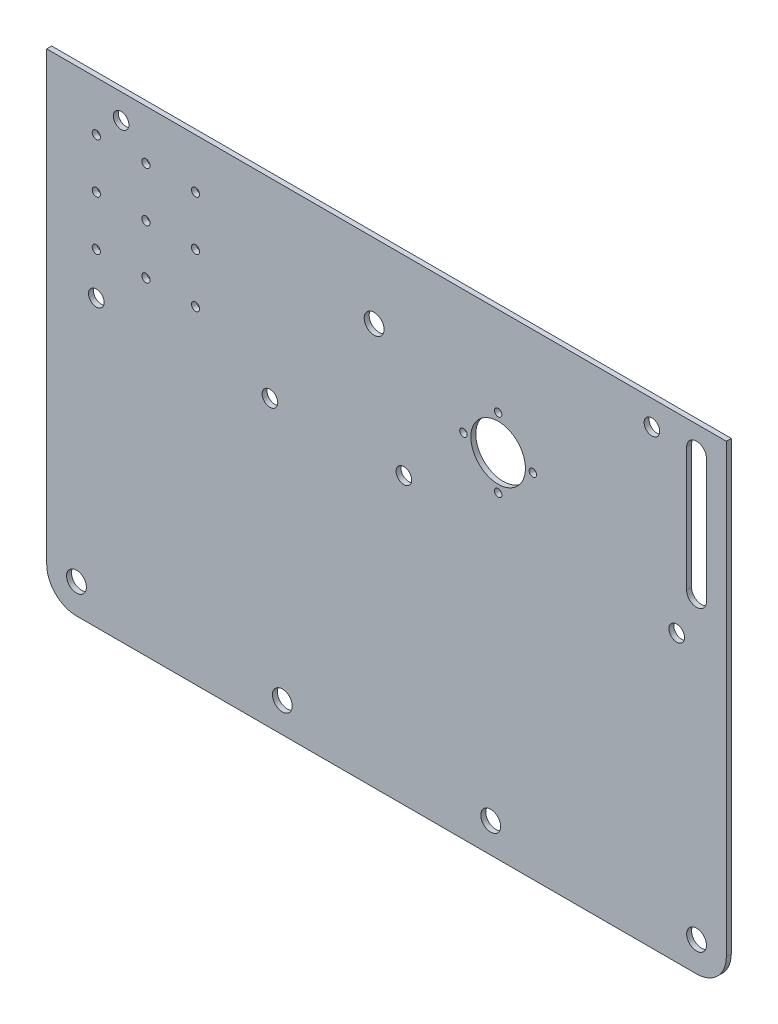
ISO-10303-21;
HEADER;
FILE_DESCRIPTION(('STEP AP214'),'2;1');
FILE_NAME('part.step','',(''),(''),'','','');
FILE_SCHEMA(('AUTOMOTIVE_DESIGN { 1 0 10303 214 1 1 1 1 }'));
ENDSEC;
DATA;
#1=APPLICATION_CONTEXT('core data for automotive mechanical design processes');
#2=APPLICATION_PROTOCOL_DEFINITION('international standard','automotive_design',2000,#1);
#3=PRODUCT_CONTEXT('',#1,'mechanical');
#4=PRODUCT('Part','Part','',(#3));
#5=PRODUCT_RELATED_PRODUCT_CATEGORY('part','',(#4));
#6=PRODUCT_DEFINITION_FORMATION('','',#4);
#7=PRODUCT_DEFINITION_CONTEXT('part definition',#1,'design');
#8=PRODUCT_DEFINITION('design','',#6,#7);
#9=PRODUCT_DEFINITION_SHAPE('','',#8);
#10=(LENGTH_UNIT() NAMED_UNIT(*) SI_UNIT(.MILLI.,.METRE.));
#11=(NAMED_UNIT(*) PLANE_ANGLE_UNIT() SI_UNIT($,.RADIAN.));
#12=(NAMED_UNIT(*) SI_UNIT($,.STERADIAN.) SOLID_ANGLE_UNIT());
#13=UNCERTAINTY_MEASURE_WITH_UNIT(LENGTH_MEASURE(1.E-05),#10,'distance_accuracy_value','');
#14=(GEOMETRIC_REPRESENTATION_CONTEXT(3) GLOBAL_UNCERTAINTY_ASSIGNED_CONTEXT((#13)) GLOBAL_UNIT_ASSIGNED_CONTEXT((#10,
#11,#12)) REPRESENTATION_CONTEXT('',''));
#15=CARTESIAN_POINT('',(0.,0.,0.));
#16=DIRECTION('',(0.,0.,1.));
#17=DIRECTION('',(1.,0.,0.));
#18=AXIS2_PLACEMENT_3D('',#15,#16,#17);
#19=CARTESIAN_POINT('',(0.,-12.,2.));
#20=DIRECTION('',(0.,1.,0.));
#21=DIRECTION('',(0.,0.,1.));
#22=AXIS2_PLACEMENT_3D('',#19,#20,#21);
#23=PLANE('',#22);
#24=DIRECTION('',(1.,0.,0.));
#25=VECTOR('',#24,1.);
#26=CARTESIAN_POINT('',(0.,-12.,0.));
#27=LINE('',#26,#25);
#28=CARTESIAN_POINT('',(-125.,-12.,0.));
#29=VERTEX_POINT('',#28);
#30=CARTESIAN_POINT('',(125.,-12.,0.));
#31=VERTEX_POINT('',#30);
#32=EDGE_CURVE('E280',#29,#31,#27,.T.);
#33=ORIENTED_EDGE('',*,*,#32,.T.);
#34=DIRECTION('',(0.,0.,-1.));
#35=VECTOR('',#34,1.);
#36=CARTESIAN_POINT('',(125.,-12.,2.));
#37=LINE('',#36,#35);
#38=CARTESIAN_POINT('',(125.,-12.,2.));
#39=VERTEX_POINT('',#38);
#40=EDGE_CURVE('E11',#39,#31,#37,.T.);
#41=ORIENTED_EDGE('',*,*,#40,.F.);
#42=DIRECTION('',(1.,0.,0.));
#43=VECTOR('',#42,1.);
#44=CARTESIAN_POINT('',(0.,-12.,2.));
#45=LINE('',#44,#43);
#46=CARTESIAN_POINT('',(-125.,-12.,2.));
#47=VERTEX_POINT('',#46);
#48=EDGE_CURVE('E485',#47,#39,#45,.T.);
#49=ORIENTED_EDGE('',*,*,#48,.F.);
#50=DIRECTION('',(0.,0.,-1.));
#51=VECTOR('',#50,1.);
#52=CARTESIAN_POINT('',(-125.,-12.,2.));
#53=LINE('',#52,#51);
#54=EDGE_CURVE('E65',#47,#29,#53,.T.);
#55=ORIENTED_EDGE('',*,*,#54,.T.);
#56=EDGE_LOOP('',(#33,#41,#49,#55));
#57=FACE_BOUND('',#56,.T.);
#58=ADVANCED_FACE('F45',(#57),#23,.F.);
#59=CARTESIAN_POINT('',(125.,0.,2.));
#60=DIRECTION('',(0.,0.,-1.));
#61=DIRECTION('',(-1.,0.,0.));
#62=AXIS2_PLACEMENT_3D('',#59,#60,#61);
#63=CYLINDRICAL_SURFACE('',#62,12.0000000000001);
#64=CARTESIAN_POINT('',(125.,0.,0.));
#65=DIRECTION('',(0.,0.,1.));
#66=DIRECTION('',(1.,0.,0.));
#67=AXIS2_PLACEMENT_3D('',#64,#65,#66);
#68=CIRCLE('',#67,12.0000000000001);
#69=CARTESIAN_POINT('',(137.,0.,0.));
#70=VERTEX_POINT('',#69);
#71=EDGE_CURVE('E283',#31,#70,#68,.T.);
#72=ORIENTED_EDGE('',*,*,#71,.T.);
#73=DIRECTION('',(0.,0.,-1.));
#74=VECTOR('',#73,1.);
#75=CARTESIAN_POINT('',(137.,0.,2.));
#76=LINE('',#75,#74);
#77=CARTESIAN_POINT('',(137.,0.,2.));
#78=VERTEX_POINT('',#77);
#79=EDGE_CURVE('E56',#78,#70,#76,.T.);
#80=ORIENTED_EDGE('',*,*,#79,.F.);
#81=CARTESIAN_POINT('',(125.,0.,2.));
#82=DIRECTION('',(0.,0.,1.));
#83=DIRECTION('',(1.,0.,0.));
#84=AXIS2_PLACEMENT_3D('',#81,#82,#83);
#85=CIRCLE('',#84,12.0000000000001);
#86=EDGE_CURVE('E488',#39,#78,#85,.T.);
#87=ORIENTED_EDGE('',*,*,#86,.F.);
#88=ORIENTED_EDGE('',*,*,#40,.T.);
#89=EDGE_LOOP('',(#72,#80,#87,#88));
#90=FACE_BOUND('',#89,.T.);
#91=ADVANCED_FACE('F347',(#90),#63,.T.);
#92=CARTESIAN_POINT('',(137.,0.,2.));
#93=DIRECTION('',(-1.,0.,0.));
#94=DIRECTION('',(0.,0.,1.));
#95=AXIS2_PLACEMENT_3D('',#92,#93,#94);
#96=PLANE('',#95);
#97=DIRECTION('',(0.,1.,0.));
#98=VECTOR('',#97,1.);
#99=CARTESIAN_POINT('',(137.,0.,0.));
#100=LINE('',#99,#98);
#101=CARTESIAN_POINT('',(137.,180.,0.));
#102=VERTEX_POINT('',#101);
#103=EDGE_CURVE('E286',#70,#102,#100,.T.);
#104=ORIENTED_EDGE('',*,*,#103,.T.);
#105=DIRECTION('',(0.,0.,-1.));
#106=VECTOR('',#105,1.);
#107=CARTESIAN_POINT('',(137.,180.,2.));
#108=LINE('',#107,#106);
#109=CARTESIAN_POINT('',(137.,180.,2.));
#110=VERTEX_POINT('',#109);
#111=EDGE_CURVE('E153',#110,#102,#108,.T.);
#112=ORIENTED_EDGE('',*,*,#111,.F.);
#113=DIRECTION('',(0.,1.,0.));
#114=VECTOR('',#113,1.);
#115=CARTESIAN_POINT('',(137.,0.,2.));
#116=LINE('',#115,#114);
#117=EDGE_CURVE('E139',#78,#110,#116,.T.);
#118=ORIENTED_EDGE('',*,*,#117,.F.);
#119=ORIENTED_EDGE('',*,*,#79,.T.);
#120=EDGE_LOOP('',(#104,#112,#118,#119));
#121=FACE_BOUND('',#120,.T.);
#122=ADVANCED_FACE('F352',(#121),#96,.F.);
#123=CARTESIAN_POINT('',(0.,180.,2.));
#124=DIRECTION('',(0.,-1.,0.));
#125=DIRECTION('',(1.,0.,0.));
#126=AXIS2_PLACEMENT_3D('',#123,#124,#125);
#127=PLANE('',#126);
#128=DIRECTION('',(-1.,0.,0.));
#129=VECTOR('',#128,1.);
#130=CARTESIAN_POINT('',(0.,180.,0.));
#131=LINE('',#130,#129);
#132=CARTESIAN_POINT('',(-137.,180.,0.));
#133=VERTEX_POINT('',#132);
#134=EDGE_CURVE('E149',#102,#133,#131,.T.);
#135=ORIENTED_EDGE('',*,*,#134,.T.);
#136=DIRECTION('',(0.,0.,-1.));
#137=VECTOR('',#136,1.);
#138=CARTESIAN_POINT('',(-137.,180.,2.));
#139=LINE('',#138,#137);
#140=CARTESIAN_POINT('',(-137.,180.,2.));
#141=VERTEX_POINT('',#140);
#142=EDGE_CURVE('E146',#141,#133,#139,.T.);
#143=ORIENTED_EDGE('',*,*,#142,.F.);
#144=DIRECTION('',(-1.,0.,0.));
#145=VECTOR('',#144,1.);
#146=CARTESIAN_POINT('',(0.,180.,2.));
#147=LINE('',#146,#145);
#148=EDGE_CURVE('E131',#110,#141,#147,.T.);
#149=ORIENTED_EDGE('',*,*,#148,.F.);
#150=ORIENTED_EDGE('',*,*,#111,.T.);
#151=EDGE_LOOP('',(#135,#143,#149,#150));
#152=FACE_BOUND('',#151,.T.);
#153=ADVANCED_FACE('F147',(#152),#127,.F.);
#154=CARTESIAN_POINT('',(-137.,0.,2.));
#155=DIRECTION('',(1.,0.,0.));
#156=DIRECTION('',(0.,1.,0.));
#157=AXIS2_PLACEMENT_3D('',#154,#155,#156);
#158=PLANE('',#157);
#159=DIRECTION('',(0.,-1.,0.));
#160=VECTOR('',#159,1.);
#161=CARTESIAN_POINT('',(-137.,0.,0.));
#162=LINE('',#161,#160);
#163=CARTESIAN_POINT('',(-137.,0.,0.));
#164=VERTEX_POINT('',#163);
#165=EDGE_CURVE('E291',#133,#164,#162,.T.);
#166=ORIENTED_EDGE('',*,*,#165,.T.);
#167=DIRECTION('',(0.,0.,-1.));
#168=VECTOR('',#167,1.);
#169=CARTESIAN_POINT('',(-137.,0.,2.));
#170=LINE('',#169,#168);
#171=CARTESIAN_POINT('',(-137.,0.,2.));
#172=VERTEX_POINT('',#171);
#173=EDGE_CURVE('E98',#172,#164,#170,.T.);
#174=ORIENTED_EDGE('',*,*,#173,.F.);
#175=DIRECTION('',(0.,-1.,0.));
#176=VECTOR('',#175,1.);
#177=CARTESIAN_POINT('',(-137.,0.,2.));
#178=LINE('',#177,#176);
#179=EDGE_CURVE('E137',#141,#172,#178,.T.);
#180=ORIENTED_EDGE('',*,*,#179,.F.);
#181=ORIENTED_EDGE('',*,*,#142,.T.);
#182=EDGE_LOOP('',(#166,#174,#180,#181));
#183=FACE_BOUND('',#182,.T.);
#184=ADVANCED_FACE('F155',(#183),#158,.F.);
#185=CARTESIAN_POINT('',(125.,120.,2.));
#186=DIRECTION('',(0.,0.,-1.));
#187=DIRECTION('',(-1.,0.,0.));
#188=AXIS2_PLACEMENT_3D('',#185,#186,#187);
#189=CYLINDRICAL_SURFACE('',#188,3.99999999999999);
#190=CARTESIAN_POINT('',(125.,120.,0.));
#191=DIRECTION('',(0.,0.,1.));
#192=DIRECTION('',(1.,0.,0.));
#193=AXIS2_PLACEMENT_3D('',#190,#191,#192);
#194=CIRCLE('',#193,3.99999999999999);
#195=CARTESIAN_POINT('',(121.,120.,0.));
#196=VERTEX_POINT('',#195);
#197=CARTESIAN_POINT('',(129.,120.,0.));
#198=VERTEX_POINT('',#197);
#199=EDGE_CURVE('E264',#196,#198,#194,.T.);
#200=ORIENTED_EDGE('',*,*,#199,.F.);
#201=DIRECTION('',(0.,0.,-1.));
#202=VECTOR('',#201,1.);
#203=CARTESIAN_POINT('',(121.,120.,2.));
#204=LINE('',#203,#202);
#205=CARTESIAN_POINT('',(121.,120.,2.));
#206=VERTEX_POINT('',#205);
#207=EDGE_CURVE('E49',#206,#196,#204,.T.);
#208=ORIENTED_EDGE('',*,*,#207,.F.);
#209=CARTESIAN_POINT('',(125.,120.,2.));
#210=DIRECTION('',(0.,0.,1.));
#211=DIRECTION('',(1.,0.,0.));
#212=AXIS2_PLACEMENT_3D('',#209,#210,#211);
#213=CIRCLE('',#212,3.99999999999999);
#214=CARTESIAN_POINT('',(129.,120.,2.));
#215=VERTEX_POINT('',#214);
#216=EDGE_CURVE('E329',#206,#215,#213,.T.);
#217=ORIENTED_EDGE('',*,*,#216,.T.);
#218=DIRECTION('',(0.,0.,-1.));
#219=VECTOR('',#218,1.);
#220=CARTESIAN_POINT('',(129.,120.,2.));
#221=LINE('',#220,#219);
#222=EDGE_CURVE('E160',#215,#198,#221,.T.);
#223=ORIENTED_EDGE('',*,*,#222,.T.);
#224=EDGE_LOOP('',(#200,#208,#217,#223));
#225=FACE_BOUND('',#224,.T.);
#226=ADVANCED_FACE('F328',(#225),#189,.F.);
#227=CARTESIAN_POINT('',(121.,0.,2.));
#228=DIRECTION('',(-1.,0.,0.));
#229=DIRECTION('',(0.,0.,1.));
#230=AXIS2_PLACEMENT_3D('',#227,#228,#229);
#231=PLANE('',#230);
#232=DIRECTION('',(0.,1.,0.));
#233=VECTOR('',#232,1.);
#234=CARTESIAN_POINT('',(121.,0.,0.));
#235=LINE('',#234,#233);
#236=CARTESIAN_POINT('',(121.,170.,0.));
#237=VERTEX_POINT('',#236);
#238=EDGE_CURVE('E268',#196,#237,#235,.T.);
#239=ORIENTED_EDGE('',*,*,#238,.T.);
#240=DIRECTION('',(0.,0.,-1.));
#241=VECTOR('',#240,1.);
#242=CARTESIAN_POINT('',(121.,170.,2.));
#243=LINE('',#242,#241);
#244=CARTESIAN_POINT('',(121.,170.,2.));
#245=VERTEX_POINT('',#244);
#246=EDGE_CURVE('E312',#245,#237,#243,.T.);
#247=ORIENTED_EDGE('',*,*,#246,.F.);
#248=DIRECTION('',(0.,1.,0.));
#249=VECTOR('',#248,1.);
#250=CARTESIAN_POINT('',(121.,0.,2.));
#251=LINE('',#250,#249);
#252=EDGE_CURVE('E322',#206,#245,#251,.T.);
#253=ORIENTED_EDGE('',*,*,#252,.F.);
#254=ORIENTED_EDGE('',*,*,#207,.T.);
#255=EDGE_LOOP('',(#239,#247,#253,#254));
#256=FACE_BOUND('',#255,.T.);
#257=ADVANCED_FACE('F321',(#256),#231,.F.);
#258=CARTESIAN_POINT('',(125.,170.,2.));
#259=DIRECTION('',(0.,0.,-1.));
#260=DIRECTION('',(-1.,0.,0.));
#261=AXIS2_PLACEMENT_3D('',#258,#259,#260);
#262=CYLINDRICAL_SURFACE('',#261,3.99999999999995);
#263=CARTESIAN_POINT('',(125.,170.,0.));
#264=DIRECTION('',(0.,0.,1.));
#265=DIRECTION('',(1.,0.,0.));
#266=AXIS2_PLACEMENT_3D('',#263,#264,#265);
#267=CIRCLE('',#266,3.99999999999995);
#268=CARTESIAN_POINT('',(129.,170.,0.));
#269=VERTEX_POINT('',#268);
#270=EDGE_CURVE('E272',#269,#237,#267,.T.);
#271=ORIENTED_EDGE('',*,*,#270,.F.);
#272=DIRECTION('',(0.,0.,-1.));
#273=VECTOR('',#272,1.);
#274=CARTESIAN_POINT('',(129.,170.,2.));
#275=LINE('',#274,#273);
#276=CARTESIAN_POINT('',(129.,170.,2.));
#277=VERTEX_POINT('',#276);
#278=EDGE_CURVE('E310',#277,#269,#275,.T.);
#279=ORIENTED_EDGE('',*,*,#278,.F.);
#280=CARTESIAN_POINT('',(125.,170.,2.));
#281=DIRECTION('',(0.,0.,1.));
#282=DIRECTION('',(1.,0.,0.));
#283=AXIS2_PLACEMENT_3D('',#280,#281,#282);
#284=CIRCLE('',#283,3.99999999999995);
#285=EDGE_CURVE('E476',#277,#245,#284,.T.);
#286=ORIENTED_EDGE('',*,*,#285,.T.);
#287=ORIENTED_EDGE('',*,*,#246,.T.);
#288=EDGE_LOOP('',(#271,#279,#286,#287));
#289=FACE_BOUND('',#288,.T.);
#290=ADVANCED_FACE('F336',(#289),#262,.F.);
#291=CARTESIAN_POINT('',(129.,0.,2.));
#292=DIRECTION('',(-1.,0.,0.));
#293=DIRECTION('',(0.,-1.,0.));
#294=AXIS2_PLACEMENT_3D('',#291,#292,#293);
#295=PLANE('',#294);
#296=DIRECTION('',(0.,1.,0.));
#297=VECTOR('',#296,1.);
#298=CARTESIAN_POINT('',(129.,0.,0.));
#299=LINE('',#298,#297);
#300=EDGE_CURVE('E276',#198,#269,#299,.T.);
#301=ORIENTED_EDGE('',*,*,#300,.F.);
#302=ORIENTED_EDGE('',*,*,#222,.F.);
#303=DIRECTION('',(0.,1.,0.));
#304=VECTOR('',#303,1.);
#305=CARTESIAN_POINT('',(129.,0.,2.));
#306=LINE('',#305,#304);
#307=EDGE_CURVE('E334',#215,#277,#306,.T.);
#308=ORIENTED_EDGE('',*,*,#307,.T.);
#309=ORIENTED_EDGE('',*,*,#278,.T.);
#310=EDGE_LOOP('',(#301,#302,#308,#309));
#311=FACE_BOUND('',#310,.T.);
#312=ADVANCED_FACE('F333',(#311),#295,.T.);
#313=CARTESIAN_POINT('',(-5.00000000000002,150.,2.));
#314=DIRECTION('',(0.,0.,-1.));
#315=DIRECTION('',(-1.,0.,0.));
#316=AXIS2_PLACEMENT_3D('',#313,#314,#315);
#317=CYLINDRICAL_SURFACE('',#316,4.00000000000001);
#318=CARTESIAN_POINT('',(-5.00000000000002,150.,2.));
#319=DIRECTION('',(0.,0.,1.));
#320=DIRECTION('',(1.,0.,0.));
#321=AXIS2_PLACEMENT_3D('',#318,#319,#320);
#322=CIRCLE('',#321,4.00000000000001);
#323=CARTESIAN_POINT('',(-1.00000000000001,150.,2.));
#324=VERTEX_POINT('',#323);
#325=EDGE_CURVE('E471',#324,#324,#322,.T.);
#326=ORIENTED_EDGE('',*,*,#325,.T.);
#327=EDGE_LOOP('',(#326));
#328=FACE_BOUND('',#327,.T.);
#329=CARTESIAN_POINT('',(-5.00000000000002,150.,0.));
#330=DIRECTION('',(0.,0.,1.));
#331=DIRECTION('',(1.,0.,0.));
#332=AXIS2_PLACEMENT_3D('',#329,#330,#331);
#333=CIRCLE('',#332,4.00000000000001);
#334=CARTESIAN_POINT('',(-1.00000000000001,150.,0.));
#335=VERTEX_POINT('',#334);
#336=EDGE_CURVE('E260',#335,#335,#333,.T.);
#337=ORIENTED_EDGE('',*,*,#336,.F.);
#338=EDGE_LOOP('',(#337));
#339=FACE_BOUND('',#338,.T.);
#340=ADVANCED_FACE('F343',(#328,#339),#317,.F.);
#341=CARTESIAN_POINT('',(45.,130.,2.));
#342=DIRECTION('',(0.,0.,-1.));
#343=DIRECTION('',(-1.,0.,0.));
#344=AXIS2_PLACEMENT_3D('',#341,#342,#343);
#345=CYLINDRICAL_SURFACE('',#344,11.);
#346=CARTESIAN_POINT('',(45.,130.,2.));
#347=DIRECTION('',(0.,0.,1.));
#348=DIRECTION('',(1.,0.,0.));
#349=AXIS2_PLACEMENT_3D('',#346,#347,#348);
#350=CIRCLE('',#349,11.);
#351=CARTESIAN_POINT('',(56.,130.,2.));
#352=VERTEX_POINT('',#351);
#353=EDGE_CURVE('E467',#352,#352,#350,.T.);
#354=ORIENTED_EDGE('',*,*,#353,.T.);
#355=EDGE_LOOP('',(#354));
#356=FACE_BOUND('',#355,.T.);
#357=CARTESIAN_POINT('',(45.,130.,0.));
#358=DIRECTION('',(0.,0.,1.));
#359=DIRECTION('',(1.,0.,0.));
#360=AXIS2_PLACEMENT_3D('',#357,#358,#359);
#361=CIRCLE('',#360,11.);
#362=CARTESIAN_POINT('',(56.,130.,0.));
#363=VERTEX_POINT('',#362);
#364=EDGE_CURVE('E256',#363,#363,#361,.T.);
#365=ORIENTED_EDGE('',*,*,#364,.F.);
#366=EDGE_LOOP('',(#365));
#367=FACE_BOUND('',#366,.T.);
#368=ADVANCED_FACE('F596',(#356,#367),#345,.F.);
#369=CARTESIAN_POINT('',(125.,0.,2.));
#370=DIRECTION('',(0.,0.,-1.));
#371=DIRECTION('',(-1.,0.,0.));
#372=AXIS2_PLACEMENT_3D('',#369,#370,#371);
#373=CYLINDRICAL_SURFACE('',#372,3.99999999999999);
#374=CARTESIAN_POINT('',(125.,0.,2.));
#375=DIRECTION('',(0.,0.,1.));
#376=DIRECTION('',(1.,0.,0.));
#377=AXIS2_PLACEMENT_3D('',#374,#375,#376);
#378=CIRCLE('',#377,3.99999999999999);
#379=CARTESIAN_POINT('',(129.,0.,2.));
#380=VERTEX_POINT('',#379);
#381=EDGE_CURVE('E463',#380,#380,#378,.T.);
#382=ORIENTED_EDGE('',*,*,#381,.T.);
#383=EDGE_LOOP('',(#382));
#384=FACE_BOUND('',#383,.T.);
#385=CARTESIAN_POINT('',(125.,0.,0.));
#386=DIRECTION('',(0.,0.,1.));
#387=DIRECTION('',(1.,0.,0.));
#388=AXIS2_PLACEMENT_3D('',#385,#386,#387);
#389=CIRCLE('',#388,3.99999999999999);
#390=CARTESIAN_POINT('',(129.,0.,0.));
#391=VERTEX_POINT('',#390);
#392=EDGE_CURVE('E252',#391,#391,#389,.T.);
#393=ORIENTED_EDGE('',*,*,#392,.F.);
#394=EDGE_LOOP('',(#393));
#395=FACE_BOUND('',#394,.T.);
#396=ADVANCED_FACE('F602',(#384,#395),#373,.F.);
#397=CARTESIAN_POINT('',(-125.,0.,2.));
#398=DIRECTION('',(0.,0.,-1.));
#399=DIRECTION('',(-1.,0.,0.));
#400=AXIS2_PLACEMENT_3D('',#397,#398,#399);
#401=CYLINDRICAL_SURFACE('',#400,4.00000000000001);
#402=CARTESIAN_POINT('',(-125.,0.,2.));
#403=DIRECTION('',(0.,0.,1.));
#404=DIRECTION('',(1.,0.,0.));
#405=AXIS2_PLACEMENT_3D('',#402,#403,#404);
#406=CIRCLE('',#405,4.00000000000001);
#407=CARTESIAN_POINT('',(-121.,0.,2.));
#408=VERTEX_POINT('',#407);
#409=EDGE_CURVE('E459',#408,#408,#406,.T.);
#410=ORIENTED_EDGE('',*,*,#409,.T.);
#411=EDGE_LOOP('',(#410));
#412=FACE_BOUND('',#411,.T.);
#413=CARTESIAN_POINT('',(-125.,0.,0.));
#414=DIRECTION('',(0.,0.,1.));
#415=DIRECTION('',(1.,0.,0.));
#416=AXIS2_PLACEMENT_3D('',#413,#414,#415);
#417=CIRCLE('',#416,4.00000000000001);
#418=CARTESIAN_POINT('',(-121.,0.,0.));
#419=VERTEX_POINT('',#418);
#420=EDGE_CURVE('E248',#419,#419,#417,.T.);
#421=ORIENTED_EDGE('',*,*,#420,.F.);
#422=EDGE_LOOP('',(#421));
#423=FACE_BOUND('',#422,.T.);
#424=ADVANCED_FACE('F609',(#412,#423),#401,.F.);
#425=CARTESIAN_POINT('',(45.,144.,2.));
#426=DIRECTION('',(0.,0.,-1.));
#427=DIRECTION('',(-1.,0.,0.));
#428=AXIS2_PLACEMENT_3D('',#425,#426,#427);
#429=CYLINDRICAL_SURFACE('',#428,1.5);
#430=CARTESIAN_POINT('',(45.,144.,2.));
#431=DIRECTION('',(0.,0.,1.));
#432=DIRECTION('',(1.,0.,0.));
#433=AXIS2_PLACEMENT_3D('',#430,#431,#432);
#434=CIRCLE('',#433,1.5);
#435=CARTESIAN_POINT('',(46.5,144.,2.));
#436=VERTEX_POINT('',#435);
#437=EDGE_CURVE('E455',#436,#436,#434,.T.);
#438=ORIENTED_EDGE('',*,*,#437,.T.);
#439=EDGE_LOOP('',(#438));
#440=FACE_BOUND('',#439,.T.);
#441=CARTESIAN_POINT('',(45.,144.,0.));
#442=DIRECTION('',(0.,0.,1.));
#443=DIRECTION('',(1.,0.,0.));
#444=AXIS2_PLACEMENT_3D('',#441,#442,#443);
#445=CIRCLE('',#444,1.5);
#446=CARTESIAN_POINT('',(46.5,144.,0.));
#447=VERTEX_POINT('',#446);
#448=EDGE_CURVE('E244',#447,#447,#445,.T.);
#449=ORIENTED_EDGE('',*,*,#448,.F.);
#450=EDGE_LOOP('',(#449));
#451=FACE_BOUND('',#450,.T.);
#452=ADVANCED_FACE('F613',(#440,#451),#429,.F.);
#453=CARTESIAN_POINT('',(59.,130.,2.));
#454=DIRECTION('',(0.,0.,-1.));
#455=DIRECTION('',(-1.,0.,0.));
#456=AXIS2_PLACEMENT_3D('',#453,#454,#455);
#457=CYLINDRICAL_SURFACE('',#456,1.50000000000001);
#458=CARTESIAN_POINT('',(59.,130.,2.));
#459=DIRECTION('',(0.,0.,1.));
#460=DIRECTION('',(1.,0.,0.));
#461=AXIS2_PLACEMENT_3D('',#458,#459,#460);
#462=CIRCLE('',#461,1.50000000000001);
#463=CARTESIAN_POINT('',(60.5,130.,2.));
#464=VERTEX_POINT('',#463);
#465=EDGE_CURVE('E451',#464,#464,#462,.T.);
#466=ORIENTED_EDGE('',*,*,#465,.T.);
#467=EDGE_LOOP('',(#466));
#468=FACE_BOUND('',#467,.T.);
#469=CARTESIAN_POINT('',(59.,130.,0.));
#470=DIRECTION('',(0.,0.,1.));
#471=DIRECTION('',(1.,0.,0.));
#472=AXIS2_PLACEMENT_3D('',#469,#470,#471);
#473=CIRCLE('',#472,1.50000000000001);
#474=CARTESIAN_POINT('',(60.5,130.,0.));
#475=VERTEX_POINT('',#474);
#476=EDGE_CURVE('E240',#475,#475,#473,.T.);
#477=ORIENTED_EDGE('',*,*,#476,.F.);
#478=EDGE_LOOP('',(#477));
#479=FACE_BOUND('',#478,.T.);
#480=ADVANCED_FACE('F617',(#468,#479),#457,.F.);
#481=CARTESIAN_POINT('',(45.,116.,2.));
#482=DIRECTION('',(0.,0.,-1.));
#483=DIRECTION('',(-1.,0.,0.));
#484=AXIS2_PLACEMENT_3D('',#481,#482,#483);
#485=CYLINDRICAL_SURFACE('',#484,1.5);
#486=CARTESIAN_POINT('',(45.,116.,2.));
#487=DIRECTION('',(0.,0.,1.));
#488=DIRECTION('',(1.,0.,0.));
#489=AXIS2_PLACEMENT_3D('',#486,#487,#488);
#490=CIRCLE('',#489,1.5);
#491=CARTESIAN_POINT('',(46.5,116.,2.));
#492=VERTEX_POINT('',#491);
#493=EDGE_CURVE('E447',#492,#492,#490,.T.);
#494=ORIENTED_EDGE('',*,*,#493,.T.);
#495=EDGE_LOOP('',(#494));
#496=FACE_BOUND('',#495,.T.);
#497=CARTESIAN_POINT('',(45.,116.,0.));
#498=DIRECTION('',(0.,0.,1.));
#499=DIRECTION('',(1.,0.,0.));
#500=AXIS2_PLACEMENT_3D('',#497,#498,#499);
#501=CIRCLE('',#500,1.5);
#502=CARTESIAN_POINT('',(46.5,116.,0.));
#503=VERTEX_POINT('',#502);
#504=EDGE_CURVE('E236',#503,#503,#501,.T.);
#505=ORIENTED_EDGE('',*,*,#504,.F.);
#506=EDGE_LOOP('',(#505));
#507=FACE_BOUND('',#506,.T.);
#508=ADVANCED_FACE('F621',(#496,#507),#485,.F.);
#509=CARTESIAN_POINT('',(31.,130.,2.));
#510=DIRECTION('',(0.,0.,-1.));
#511=DIRECTION('',(-1.,0.,0.));
#512=AXIS2_PLACEMENT_3D('',#509,#510,#511);
#513=CYLINDRICAL_SURFACE('',#512,1.5);
#514=CARTESIAN_POINT('',(31.,130.,2.));
#515=DIRECTION('',(0.,0.,1.));
#516=DIRECTION('',(1.,0.,0.));
#517=AXIS2_PLACEMENT_3D('',#514,#515,#516);
#518=CIRCLE('',#517,1.5);
#519=CARTESIAN_POINT('',(32.5,130.,2.));
#520=VERTEX_POINT('',#519);
#521=EDGE_CURVE('E443',#520,#520,#518,.T.);
#522=ORIENTED_EDGE('',*,*,#521,.T.);
#523=EDGE_LOOP('',(#522));
#524=FACE_BOUND('',#523,.T.);
#525=CARTESIAN_POINT('',(31.,130.,0.));
#526=DIRECTION('',(0.,0.,1.));
#527=DIRECTION('',(1.,0.,0.));
#528=AXIS2_PLACEMENT_3D('',#525,#526,#527);
#529=CIRCLE('',#528,1.5);
#530=CARTESIAN_POINT('',(32.5,130.,0.));
#531=VERTEX_POINT('',#530);
#532=EDGE_CURVE('E232',#531,#531,#529,.T.);
#533=ORIENTED_EDGE('',*,*,#532,.F.);
#534=EDGE_LOOP('',(#533));
#535=FACE_BOUND('',#534,.T.);
#536=ADVANCED_FACE('F625',(#524,#535),#513,.F.);
#537=CARTESIAN_POINT('',(-117.,103.,2.));
#538=DIRECTION('',(0.,0.,-1.));
#539=DIRECTION('',(-1.,0.,0.));
#540=AXIS2_PLACEMENT_3D('',#537,#538,#539);
#541=CYLINDRICAL_SURFACE('',#540,3.15);
#542=CARTESIAN_POINT('',(-117.,103.,2.));
#543=DIRECTION('',(0.,0.,1.));
#544=DIRECTION('',(1.,0.,0.));
#545=AXIS2_PLACEMENT_3D('',#542,#543,#544);
#546=CIRCLE('',#545,3.15);
#547=CARTESIAN_POINT('',(-113.85,103.,2.));
#548=VERTEX_POINT('',#547);
#549=EDGE_CURVE('E439',#548,#548,#546,.T.);
#550=ORIENTED_EDGE('',*,*,#549,.T.);
#551=EDGE_LOOP('',(#550));
#552=FACE_BOUND('',#551,.T.);
#553=CARTESIAN_POINT('',(-117.,103.,0.));
#554=DIRECTION('',(0.,0.,1.));
#555=DIRECTION('',(1.,0.,0.));
#556=AXIS2_PLACEMENT_3D('',#553,#554,#555);
#557=CIRCLE('',#556,3.15);
#558=CARTESIAN_POINT('',(-113.85,103.,0.));
#559=VERTEX_POINT('',#558);
#560=EDGE_CURVE('E228',#559,#559,#557,.T.);
#561=ORIENTED_EDGE('',*,*,#560,.F.);
#562=EDGE_LOOP('',(#561));
#563=FACE_BOUND('',#562,.T.);
#564=ADVANCED_FACE('F629',(#552,#563),#541,.F.);
#565=CARTESIAN_POINT('',(-46.9999999999999,103.,2.));
#566=DIRECTION('',(0.,0.,-1.));
#567=DIRECTION('',(-1.,0.,0.));
#568=AXIS2_PLACEMENT_3D('',#565,#566,#567);
#569=CYLINDRICAL_SURFACE('',#568,3.15);
#570=CARTESIAN_POINT('',(-46.9999999999999,103.,2.));
#571=DIRECTION('',(0.,0.,1.));
#572=DIRECTION('',(1.,0.,0.));
#573=AXIS2_PLACEMENT_3D('',#570,#571,#572);
#574=CIRCLE('',#573,3.15);
#575=CARTESIAN_POINT('',(-43.8499999999999,103.,2.));
#576=VERTEX_POINT('',#575);
#577=EDGE_CURVE('E435',#576,#576,#574,.T.);
#578=ORIENTED_EDGE('',*,*,#577,.T.);
#579=EDGE_LOOP('',(#578));
#580=FACE_BOUND('',#579,.T.);
#581=CARTESIAN_POINT('',(-46.9999999999999,103.,0.));
#582=DIRECTION('',(0.,0.,1.));
#583=DIRECTION('',(1.,0.,0.));
#584=AXIS2_PLACEMENT_3D('',#581,#582,#583);
#585=CIRCLE('',#584,3.15);
#586=CARTESIAN_POINT('',(-43.8499999999999,103.,0.));
#587=VERTEX_POINT('',#586);
#588=EDGE_CURVE('E224',#587,#587,#585,.T.);
#589=ORIENTED_EDGE('',*,*,#588,.F.);
#590=EDGE_LOOP('',(#589));
#591=FACE_BOUND('',#590,.T.);
#592=ADVANCED_FACE('F633',(#580,#591),#569,.F.);
#593=CARTESIAN_POINT('',(7.00000000000009,103.,2.));
#594=DIRECTION('',(0.,0.,-1.));
#595=DIRECTION('',(-1.,0.,0.));
#596=AXIS2_PLACEMENT_3D('',#593,#594,#595);
#597=CYLINDRICAL_SURFACE('',#596,3.15);
#598=CARTESIAN_POINT('',(7.00000000000009,103.,2.));
#599=DIRECTION('',(0.,0.,1.));
#600=DIRECTION('',(1.,0.,0.));
#601=AXIS2_PLACEMENT_3D('',#598,#599,#600);
#602=CIRCLE('',#601,3.15);
#603=CARTESIAN_POINT('',(10.1500000000001,103.,2.));
#604=VERTEX_POINT('',#603);
#605=EDGE_CURVE('E431',#604,#604,#602,.T.);
#606=ORIENTED_EDGE('',*,*,#605,.T.);
#607=EDGE_LOOP('',(#606));
#608=FACE_BOUND('',#607,.T.);
#609=CARTESIAN_POINT('',(7.00000000000009,103.,0.));
#610=DIRECTION('',(0.,0.,1.));
#611=DIRECTION('',(1.,0.,0.));
#612=AXIS2_PLACEMENT_3D('',#609,#610,#611);
#613=CIRCLE('',#612,3.15);
#614=CARTESIAN_POINT('',(10.1500000000001,103.,0.));
#615=VERTEX_POINT('',#614);
#616=EDGE_CURVE('E220',#615,#615,#613,.T.);
#617=ORIENTED_EDGE('',*,*,#616,.F.);
#618=EDGE_LOOP('',(#617));
#619=FACE_BOUND('',#618,.T.);
#620=ADVANCED_FACE('F637',(#608,#619),#597,.F.);
#621=CARTESIAN_POINT('',(117.,103.,2.));
#622=DIRECTION('',(0.,0.,-1.));
#623=DIRECTION('',(-1.,0.,0.));
#624=AXIS2_PLACEMENT_3D('',#621,#622,#623);
#625=CYLINDRICAL_SURFACE('',#624,3.15);
#626=CARTESIAN_POINT('',(117.,103.,2.));
#627=DIRECTION('',(0.,0.,1.));
#628=DIRECTION('',(1.,0.,0.));
#629=AXIS2_PLACEMENT_3D('',#626,#627,#628);
#630=CIRCLE('',#629,3.15);
#631=CARTESIAN_POINT('',(120.15,103.,2.));
#632=VERTEX_POINT('',#631);
#633=EDGE_CURVE('E427',#632,#632,#630,.T.);
#634=ORIENTED_EDGE('',*,*,#633,.T.);
#635=EDGE_LOOP('',(#634));
#636=FACE_BOUND('',#635,.T.);
#637=CARTESIAN_POINT('',(117.,103.,0.));
#638=DIRECTION('',(0.,0.,1.));
#639=DIRECTION('',(1.,0.,0.));
#640=AXIS2_PLACEMENT_3D('',#637,#638,#639);
#641=CIRCLE('',#640,3.15);
#642=CARTESIAN_POINT('',(120.15,103.,0.));
#643=VERTEX_POINT('',#642);
#644=EDGE_CURVE('E216',#643,#643,#641,.T.);
#645=ORIENTED_EDGE('',*,*,#644,.F.);
#646=EDGE_LOOP('',(#645));
#647=FACE_BOUND('',#646,.T.);
#648=ADVANCED_FACE('F641',(#636,#647),#625,.F.);
#649=CARTESIAN_POINT('',(-107.,170.,2.));
#650=DIRECTION('',(0.,0.,-1.));
#651=DIRECTION('',(-1.,0.,0.));
#652=AXIS2_PLACEMENT_3D('',#649,#650,#651);
#653=CYLINDRICAL_SURFACE('',#652,3.15);
#654=CARTESIAN_POINT('',(-107.,170.,2.));
#655=DIRECTION('',(0.,0.,1.));
#656=DIRECTION('',(1.,0.,0.));
#657=AXIS2_PLACEMENT_3D('',#654,#655,#656);
#658=CIRCLE('',#657,3.15);
#659=CARTESIAN_POINT('',(-103.85,170.,2.));
#660=VERTEX_POINT('',#659);
#661=EDGE_CURVE('E423',#660,#660,#658,.T.);
#662=ORIENTED_EDGE('',*,*,#661,.T.);
#663=EDGE_LOOP('',(#662));
#664=FACE_BOUND('',#663,.T.);
#665=CARTESIAN_POINT('',(-107.,170.,0.));
#666=DIRECTION('',(0.,0.,1.));
#667=DIRECTION('',(1.,0.,0.));
#668=AXIS2_PLACEMENT_3D('',#665,#666,#667);
#669=CIRCLE('',#668,3.15);
#670=CARTESIAN_POINT('',(-103.85,170.,0.));
#671=VERTEX_POINT('',#670);
#672=EDGE_CURVE('E212',#671,#671,#669,.T.);
#673=ORIENTED_EDGE('',*,*,#672,.F.);
#674=EDGE_LOOP('',(#673));
#675=FACE_BOUND('',#674,.T.);
#676=ADVANCED_FACE('F645',(#664,#675),#653,.F.);
#677=CARTESIAN_POINT('',(107.,170.,2.));
#678=DIRECTION('',(0.,0.,-1.));
#679=DIRECTION('',(-1.,0.,0.));
#680=AXIS2_PLACEMENT_3D('',#677,#678,#679);
#681=CYLINDRICAL_SURFACE('',#680,3.15000000000002);
#682=CARTESIAN_POINT('',(107.,170.,2.));
#683=DIRECTION('',(0.,0.,1.));
#684=DIRECTION('',(1.,0.,0.));
#685=AXIS2_PLACEMENT_3D('',#682,#683,#684);
#686=CIRCLE('',#685,3.15000000000002);
#687=CARTESIAN_POINT('',(110.15,170.,2.));
#688=VERTEX_POINT('',#687);
#689=EDGE_CURVE('E419',#688,#688,#686,.T.);
#690=ORIENTED_EDGE('',*,*,#689,.T.);
#691=EDGE_LOOP('',(#690));
#692=FACE_BOUND('',#691,.T.);
#693=CARTESIAN_POINT('',(107.,170.,0.));
#694=DIRECTION('',(0.,0.,1.));
#695=DIRECTION('',(1.,0.,0.));
#696=AXIS2_PLACEMENT_3D('',#693,#694,#695);
#697=CIRCLE('',#696,3.15000000000002);
#698=CARTESIAN_POINT('',(110.15,170.,0.));
#699=VERTEX_POINT('',#698);
#700=EDGE_CURVE('E208',#699,#699,#697,.T.);
#701=ORIENTED_EDGE('',*,*,#700,.F.);
#702=EDGE_LOOP('',(#701));
#703=FACE_BOUND('',#702,.T.);
#704=ADVANCED_FACE('F649',(#692,#703),#681,.F.);
#705=CARTESIAN_POINT('',(-117.,160.,2.));
#706=DIRECTION('',(0.,0.,-1.));
#707=DIRECTION('',(-1.,0.,0.));
#708=AXIS2_PLACEMENT_3D('',#705,#706,#707);
#709=CYLINDRICAL_SURFACE('',#708,1.65000000000002);
#710=CARTESIAN_POINT('',(-117.,160.,2.));
#711=DIRECTION('',(0.,0.,1.));
#712=DIRECTION('',(1.,0.,0.));
#713=AXIS2_PLACEMENT_3D('',#710,#711,#712);
#714=CIRCLE('',#713,1.65000000000002);
#715=CARTESIAN_POINT('',(-115.35,160.,2.));
#716=VERTEX_POINT('',#715);
#717=EDGE_CURVE('E415',#716,#716,#714,.T.);
#718=ORIENTED_EDGE('',*,*,#717,.T.);
#719=EDGE_LOOP('',(#718));
#720=FACE_BOUND('',#719,.T.);
#721=CARTESIAN_POINT('',(-117.,160.,0.));
#722=DIRECTION('',(0.,0.,1.));
#723=DIRECTION('',(1.,0.,0.));
#724=AXIS2_PLACEMENT_3D('',#721,#722,#723);
#725=CIRCLE('',#724,1.65000000000002);
#726=CARTESIAN_POINT('',(-115.35,160.,0.));
#727=VERTEX_POINT('',#726);
#728=EDGE_CURVE('E204',#727,#727,#725,.T.);
#729=ORIENTED_EDGE('',*,*,#728,.F.);
#730=EDGE_LOOP('',(#729));
#731=FACE_BOUND('',#730,.T.);
#732=ADVANCED_FACE('F653',(#720,#731),#709,.F.);
#733=CARTESIAN_POINT('',(-117.,140.,2.));
#734=DIRECTION('',(0.,0.,-1.));
#735=DIRECTION('',(-1.,0.,0.));
#736=AXIS2_PLACEMENT_3D('',#733,#734,#735);
#737=CYLINDRICAL_SURFACE('',#736,1.65000000000001);
#738=CARTESIAN_POINT('',(-117.,140.,2.));
#739=DIRECTION('',(0.,0.,1.));
#740=DIRECTION('',(1.,0.,0.));
#741=AXIS2_PLACEMENT_3D('',#738,#739,#740);
#742=CIRCLE('',#741,1.65000000000001);
#743=CARTESIAN_POINT('',(-115.35,140.,2.));
#744=VERTEX_POINT('',#743);
#745=EDGE_CURVE('E411',#744,#744,#742,.T.);
#746=ORIENTED_EDGE('',*,*,#745,.T.);
#747=EDGE_LOOP('',(#746));
#748=FACE_BOUND('',#747,.T.);
#749=CARTESIAN_POINT('',(-117.,140.,0.));
#750=DIRECTION('',(0.,0.,1.));
#751=DIRECTION('',(1.,0.,0.));
#752=AXIS2_PLACEMENT_3D('',#749,#750,#751);
#753=CIRCLE('',#752,1.65000000000001);
#754=CARTESIAN_POINT('',(-115.35,140.,0.));
#755=VERTEX_POINT('',#754);
#756=EDGE_CURVE('E200',#755,#755,#753,.T.);
#757=ORIENTED_EDGE('',*,*,#756,.F.);
#758=EDGE_LOOP('',(#757));
#759=FACE_BOUND('',#758,.T.);
#760=ADVANCED_FACE('F657',(#748,#759),#737,.F.);
#761=CARTESIAN_POINT('',(-117.,120.,2.));
#762=DIRECTION('',(0.,0.,-1.));
#763=DIRECTION('',(-1.,0.,0.));
#764=AXIS2_PLACEMENT_3D('',#761,#762,#763);
#765=CYLINDRICAL_SURFACE('',#764,1.65);
#766=CARTESIAN_POINT('',(-117.,120.,2.));
#767=DIRECTION('',(0.,0.,1.));
#768=DIRECTION('',(1.,0.,0.));
#769=AXIS2_PLACEMENT_3D('',#766,#767,#768);
#770=CIRCLE('',#769,1.65);
#771=CARTESIAN_POINT('',(-115.35,120.,2.));
#772=VERTEX_POINT('',#771);
#773=EDGE_CURVE('E407',#772,#772,#770,.T.);
#774=ORIENTED_EDGE('',*,*,#773,.T.);
#775=EDGE_LOOP('',(#774));
#776=FACE_BOUND('',#775,.T.);
#777=CARTESIAN_POINT('',(-117.,120.,0.));
#778=DIRECTION('',(0.,0.,1.));
#779=DIRECTION('',(1.,0.,0.));
#780=AXIS2_PLACEMENT_3D('',#777,#778,#779);
#781=CIRCLE('',#780,1.65);
#782=CARTESIAN_POINT('',(-115.35,120.,0.));
#783=VERTEX_POINT('',#782);
#784=EDGE_CURVE('E196',#783,#783,#781,.T.);
#785=ORIENTED_EDGE('',*,*,#784,.F.);
#786=EDGE_LOOP('',(#785));
#787=FACE_BOUND('',#786,.T.);
#788=ADVANCED_FACE('F661',(#776,#787),#765,.F.);
#789=CARTESIAN_POINT('',(-97.,160.,2.));
#790=DIRECTION('',(0.,0.,-1.));
#791=DIRECTION('',(-1.,0.,0.));
#792=AXIS2_PLACEMENT_3D('',#789,#790,#791);
#793=CYLINDRICAL_SURFACE('',#792,1.65000000000002);
#794=CARTESIAN_POINT('',(-97.,160.,2.));
#795=DIRECTION('',(0.,0.,1.));
#796=DIRECTION('',(1.,0.,0.));
#797=AXIS2_PLACEMENT_3D('',#794,#795,#796);
#798=CIRCLE('',#797,1.65000000000002);
#799=CARTESIAN_POINT('',(-95.35,160.,2.));
#800=VERTEX_POINT('',#799);
#801=EDGE_CURVE('E403',#800,#800,#798,.T.);
#802=ORIENTED_EDGE('',*,*,#801,.T.);
#803=EDGE_LOOP('',(#802));
#804=FACE_BOUND('',#803,.T.);
#805=CARTESIAN_POINT('',(-97.,160.,0.));
#806=DIRECTION('',(0.,0.,1.));
#807=DIRECTION('',(1.,0.,0.));
#808=AXIS2_PLACEMENT_3D('',#805,#806,#807);
#809=CIRCLE('',#808,1.65000000000002);
#810=CARTESIAN_POINT('',(-95.35,160.,0.));
#811=VERTEX_POINT('',#810);
#812=EDGE_CURVE('E192',#811,#811,#809,.T.);
#813=ORIENTED_EDGE('',*,*,#812,.F.);
#814=EDGE_LOOP('',(#813));
#815=FACE_BOUND('',#814,.T.);
#816=ADVANCED_FACE('F665',(#804,#815),#793,.F.);
#817=CARTESIAN_POINT('',(-97.,140.,2.));
#818=DIRECTION('',(0.,0.,-1.));
#819=DIRECTION('',(-1.,0.,0.));
#820=AXIS2_PLACEMENT_3D('',#817,#818,#819);
#821=CYLINDRICAL_SURFACE('',#820,1.65000000000001);
#822=CARTESIAN_POINT('',(-97.,140.,2.));
#823=DIRECTION('',(0.,0.,1.));
#824=DIRECTION('',(1.,0.,0.));
#825=AXIS2_PLACEMENT_3D('',#822,#823,#824);
#826=CIRCLE('',#825,1.65000000000001);
#827=CARTESIAN_POINT('',(-95.35,140.,2.));
#828=VERTEX_POINT('',#827);
#829=EDGE_CURVE('E399',#828,#828,#826,.T.);
#830=ORIENTED_EDGE('',*,*,#829,.T.);
#831=EDGE_LOOP('',(#830));
#832=FACE_BOUND('',#831,.T.);
#833=CARTESIAN_POINT('',(-97.,140.,0.));
#834=DIRECTION('',(0.,0.,1.));
#835=DIRECTION('',(1.,0.,0.));
#836=AXIS2_PLACEMENT_3D('',#833,#834,#835);
#837=CIRCLE('',#836,1.65000000000001);
#838=CARTESIAN_POINT('',(-95.35,140.,0.));
#839=VERTEX_POINT('',#838);
#840=EDGE_CURVE('E188',#839,#839,#837,.T.);
#841=ORIENTED_EDGE('',*,*,#840,.F.);
#842=EDGE_LOOP('',(#841));
#843=FACE_BOUND('',#842,.T.);
#844=ADVANCED_FACE('F669',(#832,#843),#821,.F.);
#845=CARTESIAN_POINT('',(-97.,120.,2.));
#846=DIRECTION('',(0.,0.,-1.));
#847=DIRECTION('',(-1.,0.,0.));
#848=AXIS2_PLACEMENT_3D('',#845,#846,#847);
#849=CYLINDRICAL_SURFACE('',#848,1.65);
#850=CARTESIAN_POINT('',(-97.,120.,2.));
#851=DIRECTION('',(0.,0.,1.));
#852=DIRECTION('',(1.,0.,0.));
#853=AXIS2_PLACEMENT_3D('',#850,#851,#852);
#854=CIRCLE('',#853,1.65);
#855=CARTESIAN_POINT('',(-95.35,120.,2.));
#856=VERTEX_POINT('',#855);
#857=EDGE_CURVE('E395',#856,#856,#854,.T.);
#858=ORIENTED_EDGE('',*,*,#857,.T.);
#859=EDGE_LOOP('',(#858));
#860=FACE_BOUND('',#859,.T.);
#861=CARTESIAN_POINT('',(-97.,120.,0.));
#862=DIRECTION('',(0.,0.,1.));
#863=DIRECTION('',(1.,0.,0.));
#864=AXIS2_PLACEMENT_3D('',#861,#862,#863);
#865=CIRCLE('',#864,1.65);
#866=CARTESIAN_POINT('',(-95.35,120.,0.));
#867=VERTEX_POINT('',#866);
#868=EDGE_CURVE('E184',#867,#867,#865,.T.);
#869=ORIENTED_EDGE('',*,*,#868,.F.);
#870=EDGE_LOOP('',(#869));
#871=FACE_BOUND('',#870,.T.);
#872=ADVANCED_FACE('F673',(#860,#871),#849,.F.);
#873=CARTESIAN_POINT('',(-77.,160.,2.));
#874=DIRECTION('',(0.,0.,-1.));
#875=DIRECTION('',(-1.,0.,0.));
#876=AXIS2_PLACEMENT_3D('',#873,#874,#875);
#877=CYLINDRICAL_SURFACE('',#876,1.65000000000002);
#878=CARTESIAN_POINT('',(-77.,160.,2.));
#879=DIRECTION('',(0.,0.,1.));
#880=DIRECTION('',(1.,0.,0.));
#881=AXIS2_PLACEMENT_3D('',#878,#879,#880);
#882=CIRCLE('',#881,1.65000000000002);
#883=CARTESIAN_POINT('',(-75.35,160.,2.));
#884=VERTEX_POINT('',#883);
#885=EDGE_CURVE('E391',#884,#884,#882,.T.);
#886=ORIENTED_EDGE('',*,*,#885,.T.);
#887=EDGE_LOOP('',(#886));
#888=FACE_BOUND('',#887,.T.);
#889=CARTESIAN_POINT('',(-77.,160.,0.));
#890=DIRECTION('',(0.,0.,1.));
#891=DIRECTION('',(1.,0.,0.));
#892=AXIS2_PLACEMENT_3D('',#889,#890,#891);
#893=CIRCLE('',#892,1.65000000000002);
#894=CARTESIAN_POINT('',(-75.35,160.,0.));
#895=VERTEX_POINT('',#894);
#896=EDGE_CURVE('E180',#895,#895,#893,.T.);
#897=ORIENTED_EDGE('',*,*,#896,.F.);
#898=EDGE_LOOP('',(#897));
#899=FACE_BOUND('',#898,.T.);
#900=ADVANCED_FACE('F677',(#888,#899),#877,.F.);
#901=CARTESIAN_POINT('',(-77.,140.,2.));
#902=DIRECTION('',(0.,0.,-1.));
#903=DIRECTION('',(-1.,0.,0.));
#904=AXIS2_PLACEMENT_3D('',#901,#902,#903);
#905=CYLINDRICAL_SURFACE('',#904,1.64999999999999);
#906=CARTESIAN_POINT('',(-77.,140.,2.));
#907=DIRECTION('',(0.,0.,1.));
#908=DIRECTION('',(1.,0.,0.));
#909=AXIS2_PLACEMENT_3D('',#906,#907,#908);
#910=CIRCLE('',#909,1.64999999999999);
#911=CARTESIAN_POINT('',(-75.35,140.,2.));
#912=VERTEX_POINT('',#911);
#913=EDGE_CURVE('E387',#912,#912,#910,.T.);
#914=ORIENTED_EDGE('',*,*,#913,.T.);
#915=EDGE_LOOP('',(#914));
#916=FACE_BOUND('',#915,.T.);
#917=CARTESIAN_POINT('',(-77.,140.,0.));
#918=DIRECTION('',(0.,0.,1.));
#919=DIRECTION('',(1.,0.,0.));
#920=AXIS2_PLACEMENT_3D('',#917,#918,#919);
#921=CIRCLE('',#920,1.64999999999999);
#922=CARTESIAN_POINT('',(-75.35,140.,0.));
#923=VERTEX_POINT('',#922);
#924=EDGE_CURVE('E176',#923,#923,#921,.T.);
#925=ORIENTED_EDGE('',*,*,#924,.F.);
#926=EDGE_LOOP('',(#925));
#927=FACE_BOUND('',#926,.T.);
#928=ADVANCED_FACE('F681',(#916,#927),#905,.F.);
#929=CARTESIAN_POINT('',(-77.,120.,2.));
#930=DIRECTION('',(0.,0.,-1.));
#931=DIRECTION('',(-1.,0.,0.));
#932=AXIS2_PLACEMENT_3D('',#929,#930,#931);
#933=CYLINDRICAL_SURFACE('',#932,1.64999999999999);
#934=CARTESIAN_POINT('',(-77.,120.,2.));
#935=DIRECTION('',(0.,0.,1.));
#936=DIRECTION('',(1.,0.,0.));
#937=AXIS2_PLACEMENT_3D('',#934,#935,#936);
#938=CIRCLE('',#937,1.64999999999999);
#939=CARTESIAN_POINT('',(-75.35,120.,2.));
#940=VERTEX_POINT('',#939);
#941=EDGE_CURVE('E383',#940,#940,#938,.T.);
#942=ORIENTED_EDGE('',*,*,#941,.T.);
#943=EDGE_LOOP('',(#942));
#944=FACE_BOUND('',#943,.T.);
#945=CARTESIAN_POINT('',(-77.,120.,0.));
#946=DIRECTION('',(0.,0.,1.));
#947=DIRECTION('',(1.,0.,0.));
#948=AXIS2_PLACEMENT_3D('',#945,#946,#947);
#949=CIRCLE('',#948,1.64999999999999);
#950=CARTESIAN_POINT('',(-75.35,120.,0.));
#951=VERTEX_POINT('',#950);
#952=EDGE_CURVE('E172',#951,#951,#949,.T.);
#953=ORIENTED_EDGE('',*,*,#952,.F.);
#954=EDGE_LOOP('',(#953));
#955=FACE_BOUND('',#954,.T.);
#956=ADVANCED_FACE('F685',(#944,#955),#933,.F.);
#957=CARTESIAN_POINT('',(-42.,0.,2.));
#958=DIRECTION('',(0.,0.,-1.));
#959=DIRECTION('',(-1.,0.,0.));
#960=AXIS2_PLACEMENT_3D('',#957,#958,#959);
#961=CYLINDRICAL_SURFACE('',#960,4.00000000000001);
#962=CARTESIAN_POINT('',(-42.,0.,2.));
#963=DIRECTION('',(0.,0.,1.));
#964=DIRECTION('',(1.,0.,0.));
#965=AXIS2_PLACEMENT_3D('',#962,#963,#964);
#966=CIRCLE('',#965,4.00000000000001);
#967=CARTESIAN_POINT('',(-38.,0.,2.));
#968=VERTEX_POINT('',#967);
#969=EDGE_CURVE('E379',#968,#968,#966,.T.);
#970=ORIENTED_EDGE('',*,*,#969,.T.);
#971=EDGE_LOOP('',(#970));
#972=FACE_BOUND('',#971,.T.);
#973=CARTESIAN_POINT('',(-42.,0.,0.));
#974=DIRECTION('',(0.,0.,1.));
#975=DIRECTION('',(1.,0.,0.));
#976=AXIS2_PLACEMENT_3D('',#973,#974,#975);
#977=CIRCLE('',#976,4.00000000000001);
#978=CARTESIAN_POINT('',(-38.,0.,0.));
#979=VERTEX_POINT('',#978);
#980=EDGE_CURVE('E168',#979,#979,#977,.T.);
#981=ORIENTED_EDGE('',*,*,#980,.F.);
#982=EDGE_LOOP('',(#981));
#983=FACE_BOUND('',#982,.T.);
#984=ADVANCED_FACE('F544',(#972,#983),#961,.F.);
#985=CARTESIAN_POINT('',(42.,0.,2.));
#986=DIRECTION('',(0.,0.,-1.));
#987=DIRECTION('',(-1.,0.,0.));
#988=AXIS2_PLACEMENT_3D('',#985,#986,#987);
#989=CYLINDRICAL_SURFACE('',#988,4.00000000000001);
#990=CARTESIAN_POINT('',(42.,0.,2.));
#991=DIRECTION('',(0.,0.,1.));
#992=DIRECTION('',(1.,0.,0.));
#993=AXIS2_PLACEMENT_3D('',#990,#991,#992);
#994=CIRCLE('',#993,4.00000000000001);
#995=CARTESIAN_POINT('',(46.,0.,2.));
#996=VERTEX_POINT('',#995);
#997=EDGE_CURVE('E298',#996,#996,#994,.T.);
#998=ORIENTED_EDGE('',*,*,#997,.T.);
#999=EDGE_LOOP('',(#998));
#1000=FACE_BOUND('',#999,.T.);
#1001=CARTESIAN_POINT('',(42.,0.,0.));
#1002=DIRECTION('',(0.,0.,1.));
#1003=DIRECTION('',(1.,0.,0.));
#1004=AXIS2_PLACEMENT_3D('',#1001,#1002,#1003);
#1005=CIRCLE('',#1004,4.00000000000001);
#1006=CARTESIAN_POINT('',(46.,0.,0.));
#1007=VERTEX_POINT('',#1006);
#1008=EDGE_CURVE('E164',#1007,#1007,#1005,.T.);
#1009=ORIENTED_EDGE('',*,*,#1008,.F.);
#1010=EDGE_LOOP('',(#1009));
#1011=FACE_BOUND('',#1010,.T.);
#1012=ADVANCED_FACE('F47',(#1000,#1011),#989,.F.);
#1013=CARTESIAN_POINT('',(-125.,0.,2.));
#1014=DIRECTION('',(0.,0.,-1.));
#1015=DIRECTION('',(-1.,0.,0.));
#1016=AXIS2_PLACEMENT_3D('',#1013,#1014,#1015);
#1017=CYLINDRICAL_SURFACE('',#1016,12.);
#1018=CARTESIAN_POINT('',(-125.,0.,0.));
#1019=DIRECTION('',(0.,0.,1.));
#1020=DIRECTION('',(1.,0.,0.));
#1021=AXIS2_PLACEMENT_3D('',#1018,#1019,#1020);
#1022=CIRCLE('',#1021,12.);
#1023=EDGE_CURVE('E294',#29,#164,#1022,.F.);
#1024=ORIENTED_EDGE('',*,*,#1023,.F.);
#1025=ORIENTED_EDGE('',*,*,#54,.F.);
#1026=CARTESIAN_POINT('',(-125.,0.,2.));
#1027=DIRECTION('',(0.,0.,1.));
#1028=DIRECTION('',(1.,0.,0.));
#1029=AXIS2_PLACEMENT_3D('',#1026,#1027,#1028);
#1030=CIRCLE('',#1029,12.);
#1031=EDGE_CURVE('E157',#47,#172,#1030,.F.);
#1032=ORIENTED_EDGE('',*,*,#1031,.T.);
#1033=ORIENTED_EDGE('',*,*,#173,.T.);
#1034=EDGE_LOOP('',(#1024,#1025,#1032,#1033));
#1035=FACE_BOUND('',#1034,.T.);
#1036=ADVANCED_FACE('F363',(#1035),#1017,.T.);
#1037=CARTESIAN_POINT('',(0.,0.,2.));
#1038=DIRECTION('',(0.,0.,1.));
#1039=DIRECTION('',(1.,0.,0.));
#1040=AXIS2_PLACEMENT_3D('',#1037,#1038,#1039);
#1041=PLANE('',#1040);
#1042=ORIENTED_EDGE('',*,*,#997,.F.);
#1043=EDGE_LOOP('',(#1042));
#1044=FACE_BOUND('',#1043,.T.);
#1045=ORIENTED_EDGE('',*,*,#969,.F.);
#1046=EDGE_LOOP('',(#1045));
#1047=FACE_BOUND('',#1046,.T.);
#1048=ORIENTED_EDGE('',*,*,#941,.F.);
#1049=EDGE_LOOP('',(#1048));
#1050=FACE_BOUND('',#1049,.T.);
#1051=ORIENTED_EDGE('',*,*,#913,.F.);
#1052=EDGE_LOOP('',(#1051));
#1053=FACE_BOUND('',#1052,.T.);
#1054=ORIENTED_EDGE('',*,*,#885,.F.);
#1055=EDGE_LOOP('',(#1054));
#1056=FACE_BOUND('',#1055,.T.);
#1057=ORIENTED_EDGE('',*,*,#857,.F.);
#1058=EDGE_LOOP('',(#1057));
#1059=FACE_BOUND('',#1058,.T.);
#1060=ORIENTED_EDGE('',*,*,#829,.F.);
#1061=EDGE_LOOP('',(#1060));
#1062=FACE_BOUND('',#1061,.T.);
#1063=ORIENTED_EDGE('',*,*,#801,.F.);
#1064=EDGE_LOOP('',(#1063));
#1065=FACE_BOUND('',#1064,.T.);
#1066=ORIENTED_EDGE('',*,*,#773,.F.);
#1067=EDGE_LOOP('',(#1066));
#1068=FACE_BOUND('',#1067,.T.);
#1069=ORIENTED_EDGE('',*,*,#745,.F.);
#1070=EDGE_LOOP('',(#1069));
#1071=FACE_BOUND('',#1070,.T.);
#1072=ORIENTED_EDGE('',*,*,#717,.F.);
#1073=EDGE_LOOP('',(#1072));
#1074=FACE_BOUND('',#1073,.T.);
#1075=ORIENTED_EDGE('',*,*,#689,.F.);
#1076=EDGE_LOOP('',(#1075));
#1077=FACE_BOUND('',#1076,.T.);
#1078=ORIENTED_EDGE('',*,*,#661,.F.);
#1079=EDGE_LOOP('',(#1078));
#1080=FACE_BOUND('',#1079,.T.);
#1081=ORIENTED_EDGE('',*,*,#633,.F.);
#1082=EDGE_LOOP('',(#1081));
#1083=FACE_BOUND('',#1082,.T.);
#1084=ORIENTED_EDGE('',*,*,#605,.F.);
#1085=EDGE_LOOP('',(#1084));
#1086=FACE_BOUND('',#1085,.T.);
#1087=ORIENTED_EDGE('',*,*,#577,.F.);
#1088=EDGE_LOOP('',(#1087));
#1089=FACE_BOUND('',#1088,.T.);
#1090=ORIENTED_EDGE('',*,*,#549,.F.);
#1091=EDGE_LOOP('',(#1090));
#1092=FACE_BOUND('',#1091,.T.);
#1093=ORIENTED_EDGE('',*,*,#521,.F.);
#1094=EDGE_LOOP('',(#1093));
#1095=FACE_BOUND('',#1094,.T.);
#1096=ORIENTED_EDGE('',*,*,#493,.F.);
#1097=EDGE_LOOP('',(#1096));
#1098=FACE_BOUND('',#1097,.T.);
#1099=ORIENTED_EDGE('',*,*,#465,.F.);
#1100=EDGE_LOOP('',(#1099));
#1101=FACE_BOUND('',#1100,.T.);
#1102=ORIENTED_EDGE('',*,*,#437,.F.);
#1103=EDGE_LOOP('',(#1102));
#1104=FACE_BOUND('',#1103,.T.);
#1105=ORIENTED_EDGE('',*,*,#409,.F.);
#1106=EDGE_LOOP('',(#1105));
#1107=FACE_BOUND('',#1106,.T.);
#1108=ORIENTED_EDGE('',*,*,#381,.F.);
#1109=EDGE_LOOP('',(#1108));
#1110=FACE_BOUND('',#1109,.T.);
#1111=ORIENTED_EDGE('',*,*,#353,.F.);
#1112=EDGE_LOOP('',(#1111));
#1113=FACE_BOUND('',#1112,.T.);
#1114=ORIENTED_EDGE('',*,*,#325,.F.);
#1115=EDGE_LOOP('',(#1114));
#1116=FACE_BOUND('',#1115,.T.);
#1117=ORIENTED_EDGE('',*,*,#216,.F.);
#1118=ORIENTED_EDGE('',*,*,#252,.T.);
#1119=ORIENTED_EDGE('',*,*,#285,.F.);
#1120=ORIENTED_EDGE('',*,*,#307,.F.);
#1121=EDGE_LOOP('',(#1117,#1118,#1119,#1120));
#1122=FACE_BOUND('',#1121,.T.);
#1123=ORIENTED_EDGE('',*,*,#48,.T.);
#1124=ORIENTED_EDGE('',*,*,#86,.T.);
#1125=ORIENTED_EDGE('',*,*,#117,.T.);
#1126=ORIENTED_EDGE('',*,*,#148,.T.);
#1127=ORIENTED_EDGE('',*,*,#179,.T.);
#1128=ORIENTED_EDGE('',*,*,#1031,.F.);
#1129=EDGE_LOOP('',(#1123,#1124,#1125,#1126,#1127,#1128));
#1130=FACE_BOUND('',#1129,.T.);
#1131=ADVANCED_FACE('F134',(#1044,#1047,#1050,#1053,#1056,#1059,#1062,#1065,#1068,#1071,#1074,
#1077,#1080,#1083,#1086,#1089,#1092,#1095,#1098,#1101,#1104,#1107,#1110,#1113,#1116,#1122,
#1130),#1041,.T.);
#1132=CARTESIAN_POINT('',(0.,0.,0.));
#1133=DIRECTION('',(0.,0.,1.));
#1134=DIRECTION('',(1.,0.,0.));
#1135=AXIS2_PLACEMENT_3D('',#1132,#1133,#1134);
#1136=PLANE('',#1135);
#1137=ORIENTED_EDGE('',*,*,#1008,.T.);
#1138=EDGE_LOOP('',(#1137));
#1139=FACE_BOUND('',#1138,.T.);
#1140=ORIENTED_EDGE('',*,*,#980,.T.);
#1141=EDGE_LOOP('',(#1140));
#1142=FACE_BOUND('',#1141,.T.);
#1143=ORIENTED_EDGE('',*,*,#952,.T.);
#1144=EDGE_LOOP('',(#1143));
#1145=FACE_BOUND('',#1144,.T.);
#1146=ORIENTED_EDGE('',*,*,#924,.T.);
#1147=EDGE_LOOP('',(#1146));
#1148=FACE_BOUND('',#1147,.T.);
#1149=ORIENTED_EDGE('',*,*,#896,.T.);
#1150=EDGE_LOOP('',(#1149));
#1151=FACE_BOUND('',#1150,.T.);
#1152=ORIENTED_EDGE('',*,*,#868,.T.);
#1153=EDGE_LOOP('',(#1152));
#1154=FACE_BOUND('',#1153,.T.);
#1155=ORIENTED_EDGE('',*,*,#840,.T.);
#1156=EDGE_LOOP('',(#1155));
#1157=FACE_BOUND('',#1156,.T.);
#1158=ORIENTED_EDGE('',*,*,#812,.T.);
#1159=EDGE_LOOP('',(#1158));
#1160=FACE_BOUND('',#1159,.T.);
#1161=ORIENTED_EDGE('',*,*,#784,.T.);
#1162=EDGE_LOOP('',(#1161));
#1163=FACE_BOUND('',#1162,.T.);
#1164=ORIENTED_EDGE('',*,*,#756,.T.);
#1165=EDGE_LOOP('',(#1164));
#1166=FACE_BOUND('',#1165,.T.);
#1167=ORIENTED_EDGE('',*,*,#728,.T.);
#1168=EDGE_LOOP('',(#1167));
#1169=FACE_BOUND('',#1168,.T.);
#1170=ORIENTED_EDGE('',*,*,#700,.T.);
#1171=EDGE_LOOP('',(#1170));
#1172=FACE_BOUND('',#1171,.T.);
#1173=ORIENTED_EDGE('',*,*,#672,.T.);
#1174=EDGE_LOOP('',(#1173));
#1175=FACE_BOUND('',#1174,.T.);
#1176=ORIENTED_EDGE('',*,*,#644,.T.);
#1177=EDGE_LOOP('',(#1176));
#1178=FACE_BOUND('',#1177,.T.);
#1179=ORIENTED_EDGE('',*,*,#616,.T.);
#1180=EDGE_LOOP('',(#1179));
#1181=FACE_BOUND('',#1180,.T.);
#1182=ORIENTED_EDGE('',*,*,#588,.T.);
#1183=EDGE_LOOP('',(#1182));
#1184=FACE_BOUND('',#1183,.T.);
#1185=ORIENTED_EDGE('',*,*,#560,.T.);
#1186=EDGE_LOOP('',(#1185));
#1187=FACE_BOUND('',#1186,.T.);
#1188=ORIENTED_EDGE('',*,*,#532,.T.);
#1189=EDGE_LOOP('',(#1188));
#1190=FACE_BOUND('',#1189,.T.);
#1191=ORIENTED_EDGE('',*,*,#504,.T.);
#1192=EDGE_LOOP('',(#1191));
#1193=FACE_BOUND('',#1192,.T.);
#1194=ORIENTED_EDGE('',*,*,#476,.T.);
#1195=EDGE_LOOP('',(#1194));
#1196=FACE_BOUND('',#1195,.T.);
#1197=ORIENTED_EDGE('',*,*,#448,.T.);
#1198=EDGE_LOOP('',(#1197));
#1199=FACE_BOUND('',#1198,.T.);
#1200=ORIENTED_EDGE('',*,*,#420,.T.);
#1201=EDGE_LOOP('',(#1200));
#1202=FACE_BOUND('',#1201,.T.);
#1203=ORIENTED_EDGE('',*,*,#392,.T.);
#1204=EDGE_LOOP('',(#1203));
#1205=FACE_BOUND('',#1204,.T.);
#1206=ORIENTED_EDGE('',*,*,#364,.T.);
#1207=EDGE_LOOP('',(#1206));
#1208=FACE_BOUND('',#1207,.T.);
#1209=ORIENTED_EDGE('',*,*,#336,.T.);
#1210=EDGE_LOOP('',(#1209));
#1211=FACE_BOUND('',#1210,.T.);
#1212=ORIENTED_EDGE('',*,*,#199,.T.);
#1213=ORIENTED_EDGE('',*,*,#300,.T.);
#1214=ORIENTED_EDGE('',*,*,#270,.T.);
#1215=ORIENTED_EDGE('',*,*,#238,.F.);
#1216=EDGE_LOOP('',(#1212,#1213,#1214,#1215));
#1217=FACE_BOUND('',#1216,.T.);
#1218=ORIENTED_EDGE('',*,*,#32,.F.);
#1219=ORIENTED_EDGE('',*,*,#1023,.T.);
#1220=ORIENTED_EDGE('',*,*,#165,.F.);
#1221=ORIENTED_EDGE('',*,*,#134,.F.);
#1222=ORIENTED_EDGE('',*,*,#103,.F.);
#1223=ORIENTED_EDGE('',*,*,#71,.F.);
#1224=EDGE_LOOP('',(#1218,#1219,#1220,#1221,#1222,#1223));
#1225=FACE_BOUND('',#1224,.T.);
#1226=ADVANCED_FACE('F325',(#1139,#1142,#1145,#1148,#1151,#1154,#1157,#1160,#1163,#1166,#1169,
#1172,#1175,#1178,#1181,#1184,#1187,#1190,#1193,#1196,#1199,#1202,#1205,#1208,#1211,#1217,
#1225),#1136,.F.);
#1227=CLOSED_SHELL('',(#58,#91,#122,#153,#184,#226,#257,#290,#312,#340,#368,#396,#424,#452,#480,
#508,#536,#564,#592,#620,#648,#676,#704,#732,#760,#788,#816,#844,#872,#900,#928,#956,#984,#1012,
#1036,#1131,#1226));
#1228=MANIFOLD_SOLID_BREP('B2',#1227);
#1229=ADVANCED_BREP_SHAPE_REPRESENTATION('',(#18,#1228),#14);
#1230=SHAPE_DEFINITION_REPRESENTATION(#9,#1229);
ENDSEC;
END-ISO-10303-21;
